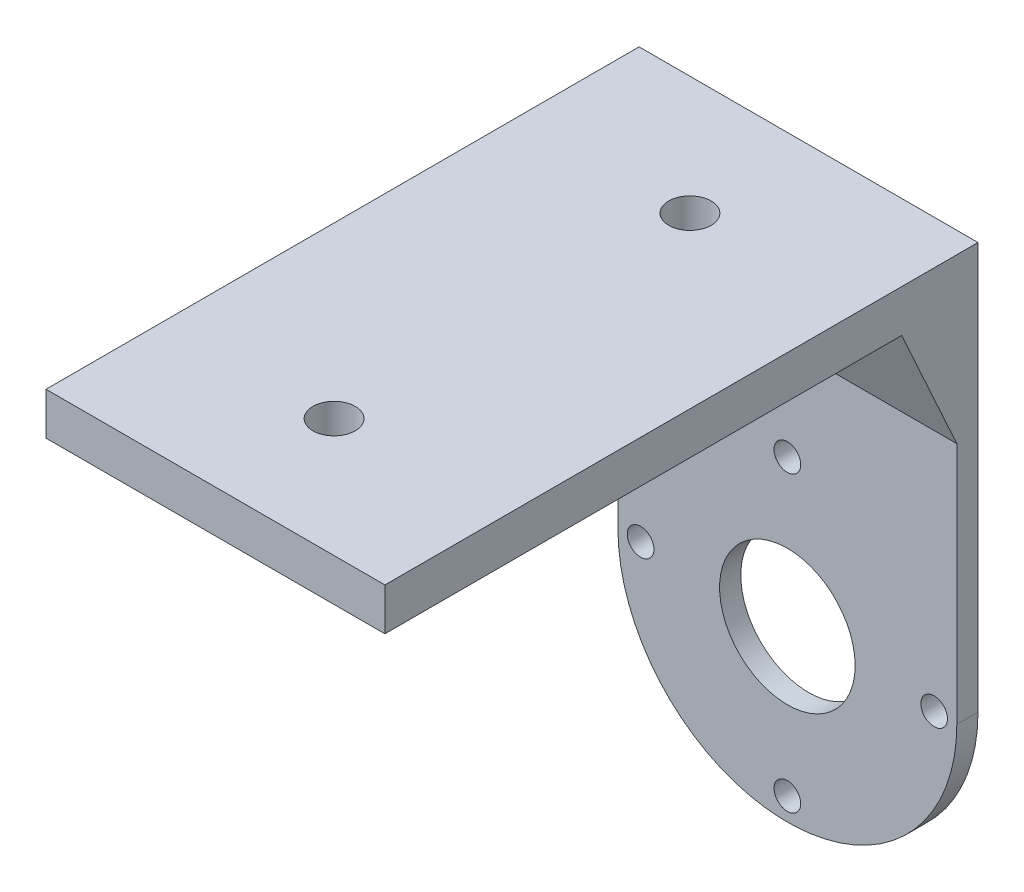
ISO-10303-21;
HEADER;
FILE_DESCRIPTION(('STEP AP214'),'2;1');
FILE_NAME('part.step','',(''),(''),'','','');
FILE_SCHEMA(('AUTOMOTIVE_DESIGN { 1 0 10303 214 1 1 1 1 }'));
ENDSEC;
DATA;
#1=APPLICATION_CONTEXT('core data for automotive mechanical design processes');
#2=APPLICATION_PROTOCOL_DEFINITION('international standard','automotive_design',2000,#1);
#3=PRODUCT_CONTEXT('',#1,'mechanical');
#4=PRODUCT('Part','Part','',(#3));
#5=PRODUCT_RELATED_PRODUCT_CATEGORY('part','',(#4));
#6=PRODUCT_DEFINITION_FORMATION('','',#4);
#7=PRODUCT_DEFINITION_CONTEXT('part definition',#1,'design');
#8=PRODUCT_DEFINITION('design','',#6,#7);
#9=PRODUCT_DEFINITION_SHAPE('','',#8);
#10=(LENGTH_UNIT() NAMED_UNIT(*) SI_UNIT(.MILLI.,.METRE.));
#11=(NAMED_UNIT(*) PLANE_ANGLE_UNIT() SI_UNIT($,.RADIAN.));
#12=(NAMED_UNIT(*) SI_UNIT($,.STERADIAN.) SOLID_ANGLE_UNIT());
#13=UNCERTAINTY_MEASURE_WITH_UNIT(LENGTH_MEASURE(1.E-05),#10,'distance_accuracy_value','');
#14=(GEOMETRIC_REPRESENTATION_CONTEXT(3) GLOBAL_UNCERTAINTY_ASSIGNED_CONTEXT((#13)) GLOBAL_UNIT_ASSIGNED_CONTEXT((#10,
#11,#12)) REPRESENTATION_CONTEXT('',''));
#15=CARTESIAN_POINT('',(0.,0.,0.));
#16=DIRECTION('',(0.,0.,1.));
#17=DIRECTION('',(1.,0.,0.));
#18=AXIS2_PLACEMENT_3D('',#15,#16,#17);
#19=CARTESIAN_POINT('',(0.,0.,3.175));
#20=DIRECTION('',(0.,0.,1.));
#21=DIRECTION('',(1.,0.,0.));
#22=AXIS2_PLACEMENT_3D('',#19,#20,#21);
#23=PLANE('',#22);
#24=DIRECTION('',(-1.,0.,0.));
#25=VECTOR('',#24,1.);
#26=CARTESIAN_POINT('',(45.3625104820768,36.4395719886517,3.175));
#27=LINE('',#26,#25);
#28=CARTESIAN_POINT('',(25.4,36.4395719886517,3.175));
#29=VERTEX_POINT('',#28);
#30=CARTESIAN_POINT('',(-25.4,36.4395719886517,3.175));
#31=VERTEX_POINT('',#30);
#32=EDGE_CURVE('E192',#29,#31,#27,.T.);
#33=ORIENTED_EDGE('',*,*,#32,.T.);
#34=DIRECTION('',(0.,-1.,0.));
#35=VECTOR('',#34,1.);
#36=CARTESIAN_POINT('',(-25.4,0.,3.175));
#37=LINE('',#36,#35);
#38=CARTESIAN_POINT('',(-25.4,0.,3.175));
#39=VERTEX_POINT('',#38);
#40=EDGE_CURVE('E57',#31,#39,#37,.T.);
#41=ORIENTED_EDGE('',*,*,#40,.T.);
#42=CARTESIAN_POINT('',(0.,0.,3.175));
#43=DIRECTION('',(0.,0.,1.));
#44=DIRECTION('',(1.,0.,0.));
#45=AXIS2_PLACEMENT_3D('',#42,#43,#44);
#46=CIRCLE('',#45,25.4);
#47=CARTESIAN_POINT('',(25.4,0.,3.175));
#48=VERTEX_POINT('',#47);
#49=EDGE_CURVE('E90',#39,#48,#46,.T.);
#50=ORIENTED_EDGE('',*,*,#49,.T.);
#51=DIRECTION('',(0.,1.,0.));
#52=VECTOR('',#51,1.);
#53=CARTESIAN_POINT('',(25.4,0.,3.175));
#54=LINE('',#53,#52);
#55=EDGE_CURVE('E184',#48,#29,#54,.T.);
#56=ORIENTED_EDGE('',*,*,#55,.T.);
#57=EDGE_LOOP('',(#33,#41,#50,#56));
#58=FACE_BOUND('',#57,.T.);
#59=CARTESIAN_POINT('',(1.53625178909098E-13,22.,3.175));
#60=DIRECTION('',(0.,0.,1.));
#61=DIRECTION('',(1.,0.,0.));
#62=AXIS2_PLACEMENT_3D('',#59,#60,#61);
#63=CIRCLE('',#62,2.);
#64=CARTESIAN_POINT('',(2.00000000000015,22.,3.175));
#65=VERTEX_POINT('',#64);
#66=EDGE_CURVE('E157',#65,#65,#63,.T.);
#67=ORIENTED_EDGE('',*,*,#66,.F.);
#68=EDGE_LOOP('',(#67));
#69=FACE_BOUND('',#68,.T.);
#70=CARTESIAN_POINT('',(0.,-22.,3.175));
#71=DIRECTION('',(0.,0.,1.));
#72=DIRECTION('',(1.,0.,0.));
#73=AXIS2_PLACEMENT_3D('',#70,#71,#72);
#74=CIRCLE('',#73,2.);
#75=CARTESIAN_POINT('',(2.,-22.,3.175));
#76=VERTEX_POINT('',#75);
#77=EDGE_CURVE('E173',#76,#76,#74,.T.);
#78=ORIENTED_EDGE('',*,*,#77,.F.);
#79=EDGE_LOOP('',(#78));
#80=FACE_BOUND('',#79,.T.);
#81=CARTESIAN_POINT('',(0.,0.,3.175));
#82=DIRECTION('',(0.,0.,1.));
#83=DIRECTION('',(1.,0.,0.));
#84=AXIS2_PLACEMENT_3D('',#81,#82,#83);
#85=CIRCLE('',#84,10.16);
#86=CARTESIAN_POINT('',(10.16,0.,3.175));
#87=VERTEX_POINT('',#86);
#88=EDGE_CURVE('E102',#87,#87,#85,.T.);
#89=ORIENTED_EDGE('',*,*,#88,.F.);
#90=EDGE_LOOP('',(#89));
#91=FACE_BOUND('',#90,.T.);
#92=CARTESIAN_POINT('',(-22.,0.,3.175));
#93=DIRECTION('',(0.,0.,1.));
#94=DIRECTION('',(1.,0.,0.));
#95=AXIS2_PLACEMENT_3D('',#92,#93,#94);
#96=CIRCLE('',#95,2.);
#97=CARTESIAN_POINT('',(-20.,0.,3.175));
#98=VERTEX_POINT('',#97);
#99=EDGE_CURVE('E165',#98,#98,#96,.T.);
#100=ORIENTED_EDGE('',*,*,#99,.F.);
#101=EDGE_LOOP('',(#100));
#102=FACE_BOUND('',#101,.T.);
#103=CARTESIAN_POINT('',(22.,-2.30437768363647E-13,3.175));
#104=DIRECTION('',(0.,0.,1.));
#105=DIRECTION('',(1.,0.,0.));
#106=AXIS2_PLACEMENT_3D('',#103,#104,#105);
#107=CIRCLE('',#106,2.);
#108=CARTESIAN_POINT('',(24.,-2.30437768363647E-13,3.175));
#109=VERTEX_POINT('',#108);
#110=EDGE_CURVE('E146',#109,#109,#107,.T.);
#111=ORIENTED_EDGE('',*,*,#110,.F.);
#112=EDGE_LOOP('',(#111));
#113=FACE_BOUND('',#112,.T.);
#114=ADVANCED_FACE('F39',(#58,#69,#80,#91,#102,#113),#23,.T.);
#115=CARTESIAN_POINT('',(0.,0.,0.));
#116=DIRECTION('',(0.,0.,1.));
#117=DIRECTION('',(1.,0.,0.));
#118=AXIS2_PLACEMENT_3D('',#115,#116,#117);
#119=PLANE('',#118);
#120=DIRECTION('',(-1.,0.,0.));
#121=VECTOR('',#120,1.);
#122=CARTESIAN_POINT('',(-25.4,60.96,0.));
#123=LINE('',#122,#121);
#124=CARTESIAN_POINT('',(25.4,60.96,0.));
#125=VERTEX_POINT('',#124);
#126=CARTESIAN_POINT('',(-25.4,60.96,0.));
#127=VERTEX_POINT('',#126);
#128=EDGE_CURVE('E75',#125,#127,#123,.T.);
#129=ORIENTED_EDGE('',*,*,#128,.F.);
#130=DIRECTION('',(0.,1.,0.));
#131=VECTOR('',#130,1.);
#132=CARTESIAN_POINT('',(25.4,0.,0.));
#133=LINE('',#132,#131);
#134=CARTESIAN_POINT('',(25.4,0.,0.));
#135=VERTEX_POINT('',#134);
#136=EDGE_CURVE('E100',#135,#125,#133,.T.);
#137=ORIENTED_EDGE('',*,*,#136,.F.);
#138=CARTESIAN_POINT('',(0.,0.,0.));
#139=DIRECTION('',(0.,0.,1.));
#140=DIRECTION('',(1.,0.,0.));
#141=AXIS2_PLACEMENT_3D('',#138,#139,#140);
#142=CIRCLE('',#141,25.4);
#143=CARTESIAN_POINT('',(-25.4,0.,0.));
#144=VERTEX_POINT('',#143);
#145=EDGE_CURVE('E95',#144,#135,#142,.T.);
#146=ORIENTED_EDGE('',*,*,#145,.F.);
#147=DIRECTION('',(0.,-1.,0.));
#148=VECTOR('',#147,1.);
#149=CARTESIAN_POINT('',(-25.4,0.,0.));
#150=LINE('',#149,#148);
#151=EDGE_CURVE('E80',#127,#144,#150,.T.);
#152=ORIENTED_EDGE('',*,*,#151,.F.);
#153=EDGE_LOOP('',(#129,#137,#146,#152));
#154=FACE_BOUND('',#153,.T.);
#155=CARTESIAN_POINT('',(22.,-2.30437768363647E-13,0.));
#156=DIRECTION('',(0.,0.,1.));
#157=DIRECTION('',(1.,0.,0.));
#158=AXIS2_PLACEMENT_3D('',#155,#156,#157);
#159=CIRCLE('',#158,2.);
#160=CARTESIAN_POINT('',(24.,-2.30437768363647E-13,0.));
#161=VERTEX_POINT('',#160);
#162=EDGE_CURVE('E140',#161,#161,#159,.T.);
#163=ORIENTED_EDGE('',*,*,#162,.T.);
#164=EDGE_LOOP('',(#163));
#165=FACE_BOUND('',#164,.T.);
#166=CARTESIAN_POINT('',(1.53625178909098E-13,22.,0.));
#167=DIRECTION('',(0.,0.,1.));
#168=DIRECTION('',(1.,0.,0.));
#169=AXIS2_PLACEMENT_3D('',#166,#167,#168);
#170=CIRCLE('',#169,2.);
#171=CARTESIAN_POINT('',(2.00000000000015,22.,0.));
#172=VERTEX_POINT('',#171);
#173=EDGE_CURVE('E155',#172,#172,#170,.T.);
#174=ORIENTED_EDGE('',*,*,#173,.T.);
#175=EDGE_LOOP('',(#174));
#176=FACE_BOUND('',#175,.T.);
#177=CARTESIAN_POINT('',(-22.,0.,0.));
#178=DIRECTION('',(0.,0.,1.));
#179=DIRECTION('',(1.,0.,0.));
#180=AXIS2_PLACEMENT_3D('',#177,#178,#179);
#181=CIRCLE('',#180,2.);
#182=CARTESIAN_POINT('',(-20.,0.,0.));
#183=VERTEX_POINT('',#182);
#184=EDGE_CURVE('E161',#183,#183,#181,.T.);
#185=ORIENTED_EDGE('',*,*,#184,.T.);
#186=EDGE_LOOP('',(#185));
#187=FACE_BOUND('',#186,.T.);
#188=CARTESIAN_POINT('',(0.,-22.,0.));
#189=DIRECTION('',(0.,0.,1.));
#190=DIRECTION('',(1.,0.,0.));
#191=AXIS2_PLACEMENT_3D('',#188,#189,#190);
#192=CIRCLE('',#191,2.);
#193=CARTESIAN_POINT('',(2.,-22.,0.));
#194=VERTEX_POINT('',#193);
#195=EDGE_CURVE('E169',#194,#194,#192,.T.);
#196=ORIENTED_EDGE('',*,*,#195,.T.);
#197=EDGE_LOOP('',(#196));
#198=FACE_BOUND('',#197,.T.);
#199=CARTESIAN_POINT('',(0.,0.,0.));
#200=DIRECTION('',(0.,0.,1.));
#201=DIRECTION('',(1.,0.,0.));
#202=AXIS2_PLACEMENT_3D('',#199,#200,#201);
#203=CIRCLE('',#202,10.16);
#204=CARTESIAN_POINT('',(10.16,0.,0.));
#205=VERTEX_POINT('',#204);
#206=EDGE_CURVE('E108',#205,#205,#203,.T.);
#207=ORIENTED_EDGE('',*,*,#206,.T.);
#208=EDGE_LOOP('',(#207));
#209=FACE_BOUND('',#208,.T.);
#210=ADVANCED_FACE('F98',(#154,#165,#176,#187,#198,#209),#119,.F.);
#211=CARTESIAN_POINT('',(0.,0.,3.175));
#212=DIRECTION('',(0.,0.,-1.));
#213=DIRECTION('',(-1.,0.,0.));
#214=AXIS2_PLACEMENT_3D('',#211,#212,#213);
#215=CYLINDRICAL_SURFACE('',#214,25.4);
#216=ORIENTED_EDGE('',*,*,#145,.T.);
#217=DIRECTION('',(0.,0.,-1.));
#218=VECTOR('',#217,1.);
#219=CARTESIAN_POINT('',(25.4,0.,3.175));
#220=LINE('',#219,#218);
#221=EDGE_CURVE('E11',#48,#135,#220,.T.);
#222=ORIENTED_EDGE('',*,*,#221,.F.);
#223=ORIENTED_EDGE('',*,*,#49,.F.);
#224=DIRECTION('',(0.,0.,-1.));
#225=VECTOR('',#224,1.);
#226=CARTESIAN_POINT('',(-25.4,0.,3.175));
#227=LINE('',#226,#225);
#228=EDGE_CURVE('E83',#39,#144,#227,.T.);
#229=ORIENTED_EDGE('',*,*,#228,.T.);
#230=EDGE_LOOP('',(#216,#222,#223,#229));
#231=FACE_BOUND('',#230,.T.);
#232=ADVANCED_FACE('F41',(#231),#215,.T.);
#233=CARTESIAN_POINT('',(25.4,0.,3.175));
#234=DIRECTION('',(-1.,0.,0.));
#235=DIRECTION('',(0.,0.,1.));
#236=AXIS2_PLACEMENT_3D('',#233,#234,#235);
#237=PLANE('',#236);
#238=DIRECTION('',(0.,0.,-1.));
#239=VECTOR('',#238,1.);
#240=CARTESIAN_POINT('',(25.4,60.96,3.175));
#241=LINE('',#240,#239);
#242=CARTESIAN_POINT('',(25.4,60.96,88.9));
#243=VERTEX_POINT('',#242);
#244=EDGE_CURVE('E49',#243,#125,#241,.T.);
#245=ORIENTED_EDGE('',*,*,#244,.F.);
#246=DIRECTION('',(0.,1.,0.));
#247=VECTOR('',#246,1.);
#248=CARTESIAN_POINT('',(25.4,54.61,88.9));
#249=LINE('',#248,#247);
#250=CARTESIAN_POINT('',(25.4,54.61,88.9));
#251=VERTEX_POINT('',#250);
#252=EDGE_CURVE('E129',#251,#243,#249,.T.);
#253=ORIENTED_EDGE('',*,*,#252,.F.);
#254=DIRECTION('',(0.,0.,-1.));
#255=VECTOR('',#254,1.);
#256=CARTESIAN_POINT('',(25.4,54.61,0.));
#257=LINE('',#256,#255);
#258=CARTESIAN_POINT('',(25.4,54.61,11.4416420408432));
#259=VERTEX_POINT('',#258);
#260=EDGE_CURVE('E148',#251,#259,#257,.T.);
#261=ORIENTED_EDGE('',*,*,#260,.T.);
#262=DIRECTION('',(0.,-0.910227600264129,-0.414108338140402));
#263=VECTOR('',#262,1.);
#264=CARTESIAN_POINT('',(25.4,54.61,11.4416420408432));
#265=LINE('',#264,#263);
#266=EDGE_CURVE('E198',#259,#29,#265,.T.);
#267=ORIENTED_EDGE('',*,*,#266,.T.);
#268=ORIENTED_EDGE('',*,*,#55,.F.);
#269=ORIENTED_EDGE('',*,*,#221,.T.);
#270=ORIENTED_EDGE('',*,*,#136,.T.);
#271=EDGE_LOOP('',(#245,#253,#261,#267,#268,#269,#270));
#272=FACE_BOUND('',#271,.T.);
#273=ADVANCED_FACE('F127',(#272),#237,.F.);
#274=CARTESIAN_POINT('',(-25.4,60.96,3.175));
#275=DIRECTION('',(0.,-1.,0.));
#276=DIRECTION('',(0.,0.,-1.));
#277=AXIS2_PLACEMENT_3D('',#274,#275,#276);
#278=PLANE('',#277);
#279=ORIENTED_EDGE('',*,*,#128,.T.);
#280=DIRECTION('',(0.,0.,-1.));
#281=VECTOR('',#280,1.);
#282=CARTESIAN_POINT('',(-25.4,60.96,3.175));
#283=LINE('',#282,#281);
#284=CARTESIAN_POINT('',(-25.4,60.96,88.9));
#285=VERTEX_POINT('',#284);
#286=EDGE_CURVE('E86',#285,#127,#283,.T.);
#287=ORIENTED_EDGE('',*,*,#286,.F.);
#288=DIRECTION('',(1.,0.,0.));
#289=VECTOR('',#288,1.);
#290=CARTESIAN_POINT('',(-25.4,60.96,88.9));
#291=LINE('',#290,#289);
#292=EDGE_CURVE('E123',#285,#243,#291,.T.);
#293=ORIENTED_EDGE('',*,*,#292,.T.);
#294=ORIENTED_EDGE('',*,*,#244,.T.);
#295=EDGE_LOOP('',(#279,#287,#293,#294));
#296=FACE_BOUND('',#295,.T.);
#297=CARTESIAN_POINT('',(0.,60.96,71.12));
#298=DIRECTION('',(0.,1.,0.));
#299=DIRECTION('',(0.,0.,1.));
#300=AXIS2_PLACEMENT_3D('',#297,#298,#299);
#301=CIRCLE('',#300,3.175);
#302=CARTESIAN_POINT('',(0.,60.96,74.295));
#303=VERTEX_POINT('',#302);
#304=EDGE_CURVE('E203',#303,#303,#301,.T.);
#305=ORIENTED_EDGE('',*,*,#304,.F.);
#306=EDGE_LOOP('',(#305));
#307=FACE_BOUND('',#306,.T.);
#308=CARTESIAN_POINT('',(0.,60.96,17.78));
#309=DIRECTION('',(0.,1.,0.));
#310=DIRECTION('',(0.,0.,1.));
#311=AXIS2_PLACEMENT_3D('',#308,#309,#310);
#312=CIRCLE('',#311,3.175);
#313=CARTESIAN_POINT('',(0.,60.96,20.955));
#314=VERTEX_POINT('',#313);
#315=EDGE_CURVE('E221',#314,#314,#312,.T.);
#316=ORIENTED_EDGE('',*,*,#315,.F.);
#317=EDGE_LOOP('',(#316));
#318=FACE_BOUND('',#317,.T.);
#319=ADVANCED_FACE('F119',(#296,#307,#318),#278,.F.);
#320=CARTESIAN_POINT('',(-25.4,0.,3.175));
#321=DIRECTION('',(1.,0.,0.));
#322=DIRECTION('',(0.,0.,-1.));
#323=AXIS2_PLACEMENT_3D('',#320,#321,#322);
#324=PLANE('',#323);
#325=ORIENTED_EDGE('',*,*,#40,.F.);
#326=DIRECTION('',(0.,0.910227600264129,0.414108338140402));
#327=VECTOR('',#326,1.);
#328=CARTESIAN_POINT('',(-25.4,54.61,11.4416420408432));
#329=LINE('',#328,#327);
#330=CARTESIAN_POINT('',(-25.4,54.61,11.4416420408432));
#331=VERTEX_POINT('',#330);
#332=EDGE_CURVE('E209',#31,#331,#329,.T.);
#333=ORIENTED_EDGE('',*,*,#332,.T.);
#334=DIRECTION('',(0.,0.,1.));
#335=VECTOR('',#334,1.);
#336=CARTESIAN_POINT('',(-25.4,54.61,0.));
#337=LINE('',#336,#335);
#338=CARTESIAN_POINT('',(-25.4,54.61,88.9));
#339=VERTEX_POINT('',#338);
#340=EDGE_CURVE('E232',#331,#339,#337,.T.);
#341=ORIENTED_EDGE('',*,*,#340,.T.);
#342=DIRECTION('',(0.,1.,0.));
#343=VECTOR('',#342,1.);
#344=CARTESIAN_POINT('',(-25.4,54.61,88.9));
#345=LINE('',#344,#343);
#346=EDGE_CURVE('E141',#339,#285,#345,.T.);
#347=ORIENTED_EDGE('',*,*,#346,.T.);
#348=ORIENTED_EDGE('',*,*,#286,.T.);
#349=ORIENTED_EDGE('',*,*,#151,.T.);
#350=ORIENTED_EDGE('',*,*,#228,.F.);
#351=EDGE_LOOP('',(#325,#333,#341,#347,#348,#349,#350));
#352=FACE_BOUND('',#351,.T.);
#353=ADVANCED_FACE('F82',(#352),#324,.F.);
#354=CARTESIAN_POINT('',(0.,0.,3.175));
#355=DIRECTION('',(0.,0.,-1.));
#356=DIRECTION('',(-1.,0.,0.));
#357=AXIS2_PLACEMENT_3D('',#354,#355,#356);
#358=CYLINDRICAL_SURFACE('',#357,10.16);
#359=ORIENTED_EDGE('',*,*,#88,.T.);
#360=EDGE_LOOP('',(#359));
#361=FACE_BOUND('',#360,.T.);
#362=ORIENTED_EDGE('',*,*,#206,.F.);
#363=EDGE_LOOP('',(#362));
#364=FACE_BOUND('',#363,.T.);
#365=ADVANCED_FACE('F268',(#361,#364),#358,.F.);
#366=CARTESIAN_POINT('',(0.,-22.,3.175));
#367=DIRECTION('',(0.,0.,-1.));
#368=DIRECTION('',(-1.,0.,0.));
#369=AXIS2_PLACEMENT_3D('',#366,#367,#368);
#370=CYLINDRICAL_SURFACE('',#369,2.);
#371=ORIENTED_EDGE('',*,*,#77,.T.);
#372=EDGE_LOOP('',(#371));
#373=FACE_BOUND('',#372,.T.);
#374=ORIENTED_EDGE('',*,*,#195,.F.);
#375=EDGE_LOOP('',(#374));
#376=FACE_BOUND('',#375,.T.);
#377=ADVANCED_FACE('F279',(#373,#376),#370,.F.);
#378=CARTESIAN_POINT('',(-22.,0.,3.175));
#379=DIRECTION('',(0.,0.,-1.));
#380=DIRECTION('',(-1.,0.,0.));
#381=AXIS2_PLACEMENT_3D('',#378,#379,#380);
#382=CYLINDRICAL_SURFACE('',#381,2.);
#383=ORIENTED_EDGE('',*,*,#99,.T.);
#384=EDGE_LOOP('',(#383));
#385=FACE_BOUND('',#384,.T.);
#386=ORIENTED_EDGE('',*,*,#184,.F.);
#387=EDGE_LOOP('',(#386));
#388=FACE_BOUND('',#387,.T.);
#389=ADVANCED_FACE('F283',(#385,#388),#382,.F.);
#390=CARTESIAN_POINT('',(1.53625178909098E-13,22.,3.175));
#391=DIRECTION('',(0.,0.,-1.));
#392=DIRECTION('',(-1.,0.,0.));
#393=AXIS2_PLACEMENT_3D('',#390,#391,#392);
#394=CYLINDRICAL_SURFACE('',#393,2.);
#395=ORIENTED_EDGE('',*,*,#66,.T.);
#396=EDGE_LOOP('',(#395));
#397=FACE_BOUND('',#396,.T.);
#398=ORIENTED_EDGE('',*,*,#173,.F.);
#399=EDGE_LOOP('',(#398));
#400=FACE_BOUND('',#399,.T.);
#401=ADVANCED_FACE('F287',(#397,#400),#394,.F.);
#402=CARTESIAN_POINT('',(22.,-2.30437768363647E-13,3.175));
#403=DIRECTION('',(0.,0.,-1.));
#404=DIRECTION('',(-1.,0.,0.));
#405=AXIS2_PLACEMENT_3D('',#402,#403,#404);
#406=CYLINDRICAL_SURFACE('',#405,2.);
#407=ORIENTED_EDGE('',*,*,#110,.T.);
#408=EDGE_LOOP('',(#407));
#409=FACE_BOUND('',#408,.T.);
#410=ORIENTED_EDGE('',*,*,#162,.F.);
#411=EDGE_LOOP('',(#410));
#412=FACE_BOUND('',#411,.T.);
#413=ADVANCED_FACE('F291',(#409,#412),#406,.F.);
#414=CARTESIAN_POINT('',(-25.4,54.61,88.9));
#415=DIRECTION('',(0.,0.,1.));
#416=DIRECTION('',(1.,0.,0.));
#417=AXIS2_PLACEMENT_3D('',#414,#415,#416);
#418=PLANE('',#417);
#419=ORIENTED_EDGE('',*,*,#292,.F.);
#420=ORIENTED_EDGE('',*,*,#346,.F.);
#421=DIRECTION('',(1.,0.,0.));
#422=VECTOR('',#421,1.);
#423=CARTESIAN_POINT('',(-25.4,54.61,88.9));
#424=LINE('',#423,#422);
#425=EDGE_CURVE('E138',#339,#251,#424,.T.);
#426=ORIENTED_EDGE('',*,*,#425,.T.);
#427=ORIENTED_EDGE('',*,*,#252,.T.);
#428=EDGE_LOOP('',(#419,#420,#426,#427));
#429=FACE_BOUND('',#428,.T.);
#430=ADVANCED_FACE('F135',(#429),#418,.T.);
#431=CARTESIAN_POINT('',(0.,54.61,0.));
#432=DIRECTION('',(0.,1.,0.));
#433=DIRECTION('',(0.,0.,1.));
#434=AXIS2_PLACEMENT_3D('',#431,#432,#433);
#435=PLANE('',#434);
#436=ORIENTED_EDGE('',*,*,#340,.F.);
#437=DIRECTION('',(-1.,0.,0.));
#438=VECTOR('',#437,1.);
#439=CARTESIAN_POINT('',(45.3625104820768,54.61,11.4416420408432));
#440=LINE('',#439,#438);
#441=EDGE_CURVE('E204',#259,#331,#440,.T.);
#442=ORIENTED_EDGE('',*,*,#441,.F.);
#443=ORIENTED_EDGE('',*,*,#260,.F.);
#444=ORIENTED_EDGE('',*,*,#425,.F.);
#445=EDGE_LOOP('',(#436,#442,#443,#444));
#446=FACE_BOUND('',#445,.T.);
#447=CARTESIAN_POINT('',(0.,54.61,71.12));
#448=DIRECTION('',(0.,1.,0.));
#449=DIRECTION('',(0.,0.,1.));
#450=AXIS2_PLACEMENT_3D('',#447,#448,#449);
#451=CIRCLE('',#450,3.175);
#452=CARTESIAN_POINT('',(0.,54.61,74.295));
#453=VERTEX_POINT('',#452);
#454=EDGE_CURVE('E217',#453,#453,#451,.T.);
#455=ORIENTED_EDGE('',*,*,#454,.T.);
#456=EDGE_LOOP('',(#455));
#457=FACE_BOUND('',#456,.T.);
#458=CARTESIAN_POINT('',(0.,54.61,17.78));
#459=DIRECTION('',(0.,1.,0.));
#460=DIRECTION('',(0.,0.,1.));
#461=AXIS2_PLACEMENT_3D('',#458,#459,#460);
#462=CIRCLE('',#461,3.175);
#463=CARTESIAN_POINT('',(0.,54.61,20.955));
#464=VERTEX_POINT('',#463);
#465=EDGE_CURVE('E225',#464,#464,#462,.T.);
#466=ORIENTED_EDGE('',*,*,#465,.T.);
#467=EDGE_LOOP('',(#466));
#468=FACE_BOUND('',#467,.T.);
#469=ADVANCED_FACE('F242',(#446,#457,#468),#435,.F.);
#470=CARTESIAN_POINT('',(0.,54.61,17.78));
#471=DIRECTION('',(0.,1.,0.));
#472=DIRECTION('',(0.,0.,1.));
#473=AXIS2_PLACEMENT_3D('',#470,#471,#472);
#474=CYLINDRICAL_SURFACE('',#473,3.175);
#475=ORIENTED_EDGE('',*,*,#465,.F.);
#476=EDGE_LOOP('',(#475));
#477=FACE_BOUND('',#476,.T.);
#478=ORIENTED_EDGE('',*,*,#315,.T.);
#479=EDGE_LOOP('',(#478));
#480=FACE_BOUND('',#479,.T.);
#481=ADVANCED_FACE('F250',(#477,#480),#474,.F.);
#482=CARTESIAN_POINT('',(0.,54.61,71.12));
#483=DIRECTION('',(0.,1.,0.));
#484=DIRECTION('',(0.,0.,1.));
#485=AXIS2_PLACEMENT_3D('',#482,#483,#484);
#486=CYLINDRICAL_SURFACE('',#485,3.175);
#487=ORIENTED_EDGE('',*,*,#454,.F.);
#488=EDGE_LOOP('',(#487));
#489=FACE_BOUND('',#488,.T.);
#490=ORIENTED_EDGE('',*,*,#304,.T.);
#491=EDGE_LOOP('',(#490));
#492=FACE_BOUND('',#491,.T.);
#493=ADVANCED_FACE('F258',(#489,#492),#486,.F.);
#494=CARTESIAN_POINT('',(45.3625104820768,54.61,11.4416420408432));
#495=DIRECTION('',(0.,-0.414108338140402,0.910227600264129));
#496=DIRECTION('',(0.,-0.910227600264129,-0.414108338140402));
#497=AXIS2_PLACEMENT_3D('',#494,#495,#496);
#498=PLANE('',#497);
#499=ORIENTED_EDGE('',*,*,#266,.F.);
#500=ORIENTED_EDGE('',*,*,#441,.T.);
#501=ORIENTED_EDGE('',*,*,#332,.F.);
#502=ORIENTED_EDGE('',*,*,#32,.F.);
#503=EDGE_LOOP('',(#499,#500,#501,#502));
#504=FACE_BOUND('',#503,.T.);
#505=ADVANCED_FACE('F207',(#504),#498,.T.);
#506=CLOSED_SHELL('',(#114,#210,#232,#273,#319,#353,#365,#377,#389,#401,#413,#430,#469,#481,
#493,#505));
#507=MANIFOLD_SOLID_BREP('B2',#506);
#508=ADVANCED_BREP_SHAPE_REPRESENTATION('',(#18,#507),#14);
#509=SHAPE_DEFINITION_REPRESENTATION(#9,#508);
ENDSEC;
END-ISO-10303-21;
